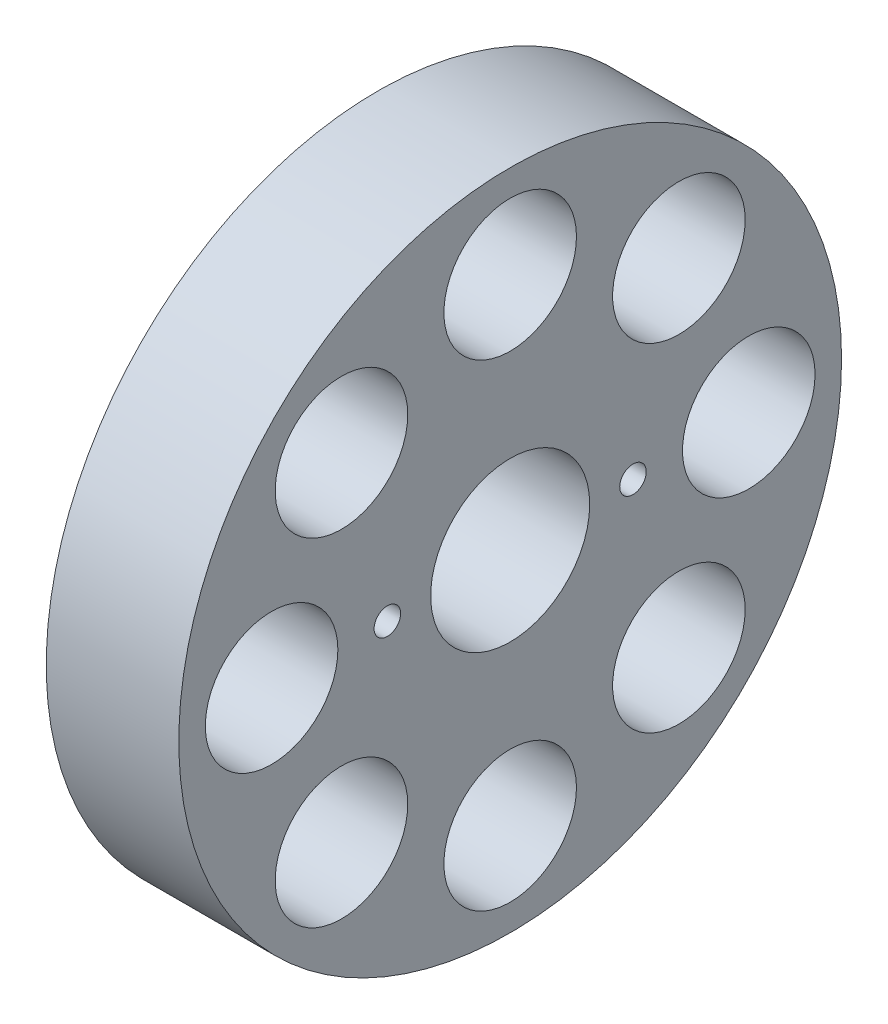
ISO-10303-21;
HEADER;
FILE_DESCRIPTION(('STEP AP214'),'2;1');
FILE_NAME('part.step','',(''),(''),'','','');
FILE_SCHEMA(('AUTOMOTIVE_DESIGN { 1 0 10303 214 1 1 1 1 }'));
ENDSEC;
DATA;
#1=APPLICATION_CONTEXT('core data for automotive mechanical design processes');
#2=APPLICATION_PROTOCOL_DEFINITION('international standard','automotive_design',2000,#1);
#3=PRODUCT_CONTEXT('',#1,'mechanical');
#4=PRODUCT('Part','Part','',(#3));
#5=PRODUCT_RELATED_PRODUCT_CATEGORY('part','',(#4));
#6=PRODUCT_DEFINITION_FORMATION('','',#4);
#7=PRODUCT_DEFINITION_CONTEXT('part definition',#1,'design');
#8=PRODUCT_DEFINITION('design','',#6,#7);
#9=PRODUCT_DEFINITION_SHAPE('','',#8);
#10=(LENGTH_UNIT() NAMED_UNIT(*) SI_UNIT(.MILLI.,.METRE.));
#11=(NAMED_UNIT(*) PLANE_ANGLE_UNIT() SI_UNIT($,.RADIAN.));
#12=(NAMED_UNIT(*) SI_UNIT($,.STERADIAN.) SOLID_ANGLE_UNIT());
#13=UNCERTAINTY_MEASURE_WITH_UNIT(LENGTH_MEASURE(1.E-05),#10,'distance_accuracy_value','');
#14=(GEOMETRIC_REPRESENTATION_CONTEXT(3) GLOBAL_UNCERTAINTY_ASSIGNED_CONTEXT((#13)) GLOBAL_UNIT_ASSIGNED_CONTEXT((#10,
#11,#12)) REPRESENTATION_CONTEXT('',''));
#15=CARTESIAN_POINT('',(0.,0.,0.));
#16=DIRECTION('',(0.,0.,1.));
#17=DIRECTION('',(1.,0.,0.));
#18=AXIS2_PLACEMENT_3D('',#15,#16,#17);
#19=CARTESIAN_POINT('',(10.,0.,0.));
#20=DIRECTION('',(1.,0.,0.));
#21=DIRECTION('',(0.,0.,-1.));
#22=AXIS2_PLACEMENT_3D('',#19,#20,#21);
#23=PLANE('',#22);
#24=CARTESIAN_POINT('',(10.,0.,9.265));
#25=DIRECTION('',(1.,0.,0.));
#26=DIRECTION('',(0.,0.,-1.));
#27=AXIS2_PLACEMENT_3D('',#24,#25,#26);
#28=CIRCLE('',#27,1.);
#29=CARTESIAN_POINT('',(10.,0.,10.265));
#30=VERTEX_POINT('',#29);
#31=EDGE_CURVE('E103',#30,#30,#28,.T.);
#32=ORIENTED_EDGE('',*,*,#31,.F.);
#33=EDGE_LOOP('',(#32));
#34=FACE_BOUND('',#33,.T.);
#35=CARTESIAN_POINT('',(10.,0.,-9.265));
#36=DIRECTION('',(1.,0.,0.));
#37=DIRECTION('',(0.,0.,-1.));
#38=AXIS2_PLACEMENT_3D('',#35,#36,#37);
#39=CIRCLE('',#38,1.);
#40=CARTESIAN_POINT('',(10.,0.,-8.265));
#41=VERTEX_POINT('',#40);
#42=EDGE_CURVE('E95',#41,#41,#39,.T.);
#43=ORIENTED_EDGE('',*,*,#42,.F.);
#44=EDGE_LOOP('',(#43));
#45=FACE_BOUND('',#44,.T.);
#46=CARTESIAN_POINT('',(10.,0.,18.));
#47=DIRECTION('',(1.,0.,0.));
#48=DIRECTION('',(0.,0.,-1.));
#49=AXIS2_PLACEMENT_3D('',#46,#47,#48);
#50=CIRCLE('',#49,5.);
#51=CARTESIAN_POINT('',(10.,0.,13.));
#52=VERTEX_POINT('',#51);
#53=EDGE_CURVE('E83',#52,#52,#50,.T.);
#54=ORIENTED_EDGE('',*,*,#53,.F.);
#55=EDGE_LOOP('',(#54));
#56=FACE_BOUND('',#55,.T.);
#57=CARTESIAN_POINT('',(10.,-18.,0.));
#58=DIRECTION('',(1.,0.,0.));
#59=DIRECTION('',(0.,0.,-1.));
#60=AXIS2_PLACEMENT_3D('',#57,#58,#59);
#61=CIRCLE('',#60,5.);
#62=CARTESIAN_POINT('',(10.,-18.,-5.00000000000001));
#63=VERTEX_POINT('',#62);
#64=EDGE_CURVE('E71',#63,#63,#61,.T.);
#65=ORIENTED_EDGE('',*,*,#64,.F.);
#66=EDGE_LOOP('',(#65));
#67=FACE_BOUND('',#66,.T.);
#68=CARTESIAN_POINT('',(10.,0.,-18.));
#69=DIRECTION('',(1.,0.,0.));
#70=DIRECTION('',(0.,0.,-1.));
#71=AXIS2_PLACEMENT_3D('',#68,#69,#70);
#72=CIRCLE('',#71,5.);
#73=CARTESIAN_POINT('',(10.,0.,-23.));
#74=VERTEX_POINT('',#73);
#75=EDGE_CURVE('E59',#74,#74,#72,.T.);
#76=ORIENTED_EDGE('',*,*,#75,.F.);
#77=EDGE_LOOP('',(#76));
#78=FACE_BOUND('',#77,.T.);
#79=CARTESIAN_POINT('',(10.,0.,0.));
#80=DIRECTION('',(1.,0.,0.));
#81=DIRECTION('',(0.,0.,-1.));
#82=AXIS2_PLACEMENT_3D('',#79,#80,#81);
#83=CIRCLE('',#82,6.);
#84=CARTESIAN_POINT('',(10.,0.,-6.));
#85=VERTEX_POINT('',#84);
#86=EDGE_CURVE('E47',#85,#85,#83,.T.);
#87=ORIENTED_EDGE('',*,*,#86,.F.);
#88=EDGE_LOOP('',(#87));
#89=FACE_BOUND('',#88,.T.);
#90=CARTESIAN_POINT('',(10.,0.,0.));
#91=DIRECTION('',(1.,0.,0.));
#92=DIRECTION('',(0.,0.,-1.));
#93=AXIS2_PLACEMENT_3D('',#90,#91,#92);
#94=CIRCLE('',#93,25.);
#95=CARTESIAN_POINT('',(10.,0.,-25.));
#96=VERTEX_POINT('',#95);
#97=EDGE_CURVE('E10',#96,#96,#94,.T.);
#98=ORIENTED_EDGE('',*,*,#97,.T.);
#99=EDGE_LOOP('',(#98));
#100=FACE_BOUND('',#99,.T.);
#101=CARTESIAN_POINT('',(10.,18.,0.));
#102=DIRECTION('',(1.,0.,0.));
#103=DIRECTION('',(0.,0.,-1.));
#104=AXIS2_PLACEMENT_3D('',#101,#102,#103);
#105=CIRCLE('',#104,5.);
#106=CARTESIAN_POINT('',(10.,18.,-5.));
#107=VERTEX_POINT('',#106);
#108=EDGE_CURVE('E42',#107,#107,#105,.T.);
#109=ORIENTED_EDGE('',*,*,#108,.F.);
#110=EDGE_LOOP('',(#109));
#111=FACE_BOUND('',#110,.T.);
#112=CARTESIAN_POINT('',(10.,12.7279220613579,-12.7279220613579));
#113=DIRECTION('',(1.,0.,0.));
#114=DIRECTION('',(0.,0.,-1.));
#115=AXIS2_PLACEMENT_3D('',#112,#113,#114);
#116=CIRCLE('',#115,5.);
#117=CARTESIAN_POINT('',(10.,12.7279220613579,-17.7279220613579));
#118=VERTEX_POINT('',#117);
#119=EDGE_CURVE('E53',#118,#118,#116,.T.);
#120=ORIENTED_EDGE('',*,*,#119,.F.);
#121=EDGE_LOOP('',(#120));
#122=FACE_BOUND('',#121,.T.);
#123=CARTESIAN_POINT('',(10.,-12.7279220613579,-12.7279220613579));
#124=DIRECTION('',(1.,0.,0.));
#125=DIRECTION('',(0.,0.,-1.));
#126=AXIS2_PLACEMENT_3D('',#123,#124,#125);
#127=CIRCLE('',#126,5.);
#128=CARTESIAN_POINT('',(10.,-12.7279220613579,-17.7279220613579));
#129=VERTEX_POINT('',#128);
#130=EDGE_CURVE('E65',#129,#129,#127,.T.);
#131=ORIENTED_EDGE('',*,*,#130,.F.);
#132=EDGE_LOOP('',(#131));
#133=FACE_BOUND('',#132,.T.);
#134=CARTESIAN_POINT('',(10.,-12.7279220613579,12.7279220613579));
#135=DIRECTION('',(1.,0.,0.));
#136=DIRECTION('',(0.,0.,-1.));
#137=AXIS2_PLACEMENT_3D('',#134,#135,#136);
#138=CIRCLE('',#137,5.);
#139=CARTESIAN_POINT('',(10.,-12.7279220613579,7.72792206135785));
#140=VERTEX_POINT('',#139);
#141=EDGE_CURVE('E77',#140,#140,#138,.T.);
#142=ORIENTED_EDGE('',*,*,#141,.F.);
#143=EDGE_LOOP('',(#142));
#144=FACE_BOUND('',#143,.T.);
#145=CARTESIAN_POINT('',(10.,12.7279220613579,12.7279220613579));
#146=DIRECTION('',(1.,0.,0.));
#147=DIRECTION('',(0.,0.,-1.));
#148=AXIS2_PLACEMENT_3D('',#145,#146,#147);
#149=CIRCLE('',#148,5.);
#150=CARTESIAN_POINT('',(10.,12.7279220613579,7.72792206135786));
#151=VERTEX_POINT('',#150);
#152=EDGE_CURVE('E89',#151,#151,#149,.T.);
#153=ORIENTED_EDGE('',*,*,#152,.F.);
#154=EDGE_LOOP('',(#153));
#155=FACE_BOUND('',#154,.T.);
#156=ADVANCED_FACE('F31',(#34,#45,#56,#67,#78,#89,#100,#111,#122,#133,#144,#155),#23,.T.);
#157=CARTESIAN_POINT('',(0.,0.,0.));
#158=DIRECTION('',(1.,0.,0.));
#159=DIRECTION('',(0.,0.,-1.));
#160=AXIS2_PLACEMENT_3D('',#157,#158,#159);
#161=PLANE('',#160);
#162=CARTESIAN_POINT('',(0.,0.,9.265));
#163=DIRECTION('',(-1.,0.,0.));
#164=DIRECTION('',(0.,0.,-1.));
#165=AXIS2_PLACEMENT_3D('',#162,#163,#164);
#166=CIRCLE('',#165,1.);
#167=CARTESIAN_POINT('',(0.,0.,10.265));
#168=VERTEX_POINT('',#167);
#169=EDGE_CURVE('E106',#168,#168,#166,.T.);
#170=ORIENTED_EDGE('',*,*,#169,.F.);
#171=EDGE_LOOP('',(#170));
#172=FACE_BOUND('',#171,.T.);
#173=CARTESIAN_POINT('',(0.,0.,-9.265));
#174=DIRECTION('',(-1.,0.,0.));
#175=DIRECTION('',(0.,0.,1.));
#176=AXIS2_PLACEMENT_3D('',#173,#174,#175);
#177=CIRCLE('',#176,1.);
#178=CARTESIAN_POINT('',(0.,0.,-8.265));
#179=VERTEX_POINT('',#178);
#180=EDGE_CURVE('E100',#179,#179,#177,.T.);
#181=ORIENTED_EDGE('',*,*,#180,.F.);
#182=EDGE_LOOP('',(#181));
#183=FACE_BOUND('',#182,.T.);
#184=CARTESIAN_POINT('',(0.,0.,0.));
#185=DIRECTION('',(1.,0.,0.));
#186=DIRECTION('',(0.,0.,-1.));
#187=AXIS2_PLACEMENT_3D('',#184,#185,#186);
#188=CIRCLE('',#187,25.);
#189=CARTESIAN_POINT('',(0.,0.,-25.));
#190=VERTEX_POINT('',#189);
#191=EDGE_CURVE('E35',#190,#190,#188,.T.);
#192=ORIENTED_EDGE('',*,*,#191,.F.);
#193=EDGE_LOOP('',(#192));
#194=FACE_BOUND('',#193,.T.);
#195=CARTESIAN_POINT('',(0.,18.,0.));
#196=DIRECTION('',(1.,0.,0.));
#197=DIRECTION('',(0.,0.,-1.));
#198=AXIS2_PLACEMENT_3D('',#195,#196,#197);
#199=CIRCLE('',#198,5.);
#200=CARTESIAN_POINT('',(0.,18.,-5.));
#201=VERTEX_POINT('',#200);
#202=EDGE_CURVE('E44',#201,#201,#199,.T.);
#203=ORIENTED_EDGE('',*,*,#202,.T.);
#204=EDGE_LOOP('',(#203));
#205=FACE_BOUND('',#204,.T.);
#206=CARTESIAN_POINT('',(0.,0.,0.));
#207=DIRECTION('',(1.,0.,0.));
#208=DIRECTION('',(0.,0.,-1.));
#209=AXIS2_PLACEMENT_3D('',#206,#207,#208);
#210=CIRCLE('',#209,6.);
#211=CARTESIAN_POINT('',(0.,0.,-6.));
#212=VERTEX_POINT('',#211);
#213=EDGE_CURVE('E50',#212,#212,#210,.T.);
#214=ORIENTED_EDGE('',*,*,#213,.T.);
#215=EDGE_LOOP('',(#214));
#216=FACE_BOUND('',#215,.T.);
#217=CARTESIAN_POINT('',(0.,12.7279220613579,-12.7279220613579));
#218=DIRECTION('',(1.,0.,0.));
#219=DIRECTION('',(0.,0.,-1.));
#220=AXIS2_PLACEMENT_3D('',#217,#218,#219);
#221=CIRCLE('',#220,5.);
#222=CARTESIAN_POINT('',(0.,12.7279220613579,-17.7279220613579));
#223=VERTEX_POINT('',#222);
#224=EDGE_CURVE('E56',#223,#223,#221,.T.);
#225=ORIENTED_EDGE('',*,*,#224,.T.);
#226=EDGE_LOOP('',(#225));
#227=FACE_BOUND('',#226,.T.);
#228=CARTESIAN_POINT('',(0.,0.,-18.));
#229=DIRECTION('',(1.,0.,0.));
#230=DIRECTION('',(0.,0.,-1.));
#231=AXIS2_PLACEMENT_3D('',#228,#229,#230);
#232=CIRCLE('',#231,5.);
#233=CARTESIAN_POINT('',(0.,0.,-23.));
#234=VERTEX_POINT('',#233);
#235=EDGE_CURVE('E62',#234,#234,#232,.T.);
#236=ORIENTED_EDGE('',*,*,#235,.T.);
#237=EDGE_LOOP('',(#236));
#238=FACE_BOUND('',#237,.T.);
#239=CARTESIAN_POINT('',(0.,-12.7279220613579,-12.7279220613579));
#240=DIRECTION('',(1.,0.,0.));
#241=DIRECTION('',(0.,0.,-1.));
#242=AXIS2_PLACEMENT_3D('',#239,#240,#241);
#243=CIRCLE('',#242,5.);
#244=CARTESIAN_POINT('',(0.,-12.7279220613579,-17.7279220613579));
#245=VERTEX_POINT('',#244);
#246=EDGE_CURVE('E68',#245,#245,#243,.T.);
#247=ORIENTED_EDGE('',*,*,#246,.T.);
#248=EDGE_LOOP('',(#247));
#249=FACE_BOUND('',#248,.T.);
#250=CARTESIAN_POINT('',(0.,-18.,0.));
#251=DIRECTION('',(1.,0.,0.));
#252=DIRECTION('',(0.,0.,-1.));
#253=AXIS2_PLACEMENT_3D('',#250,#251,#252);
#254=CIRCLE('',#253,5.);
#255=CARTESIAN_POINT('',(0.,-18.,-5.00000000000001));
#256=VERTEX_POINT('',#255);
#257=EDGE_CURVE('E74',#256,#256,#254,.T.);
#258=ORIENTED_EDGE('',*,*,#257,.T.);
#259=EDGE_LOOP('',(#258));
#260=FACE_BOUND('',#259,.T.);
#261=CARTESIAN_POINT('',(0.,-12.7279220613579,12.7279220613579));
#262=DIRECTION('',(1.,0.,0.));
#263=DIRECTION('',(0.,0.,-1.));
#264=AXIS2_PLACEMENT_3D('',#261,#262,#263);
#265=CIRCLE('',#264,5.);
#266=CARTESIAN_POINT('',(0.,-12.7279220613579,7.72792206135785));
#267=VERTEX_POINT('',#266);
#268=EDGE_CURVE('E80',#267,#267,#265,.T.);
#269=ORIENTED_EDGE('',*,*,#268,.T.);
#270=EDGE_LOOP('',(#269));
#271=FACE_BOUND('',#270,.T.);
#272=CARTESIAN_POINT('',(0.,0.,18.));
#273=DIRECTION('',(1.,0.,0.));
#274=DIRECTION('',(0.,0.,-1.));
#275=AXIS2_PLACEMENT_3D('',#272,#273,#274);
#276=CIRCLE('',#275,5.);
#277=CARTESIAN_POINT('',(0.,0.,13.));
#278=VERTEX_POINT('',#277);
#279=EDGE_CURVE('E86',#278,#278,#276,.T.);
#280=ORIENTED_EDGE('',*,*,#279,.T.);
#281=EDGE_LOOP('',(#280));
#282=FACE_BOUND('',#281,.T.);
#283=CARTESIAN_POINT('',(0.,12.7279220613579,12.7279220613579));
#284=DIRECTION('',(1.,0.,0.));
#285=DIRECTION('',(0.,0.,-1.));
#286=AXIS2_PLACEMENT_3D('',#283,#284,#285);
#287=CIRCLE('',#286,5.);
#288=CARTESIAN_POINT('',(0.,12.7279220613579,7.72792206135786));
#289=VERTEX_POINT('',#288);
#290=EDGE_CURVE('E92',#289,#289,#287,.T.);
#291=ORIENTED_EDGE('',*,*,#290,.T.);
#292=EDGE_LOOP('',(#291));
#293=FACE_BOUND('',#292,.T.);
#294=ADVANCED_FACE('F112',(#172,#183,#194,#205,#216,#227,#238,#249,#260,#271,#282,#293),#161,.F.);
#295=CARTESIAN_POINT('',(10.,0.,0.));
#296=DIRECTION('',(-1.,0.,0.));
#297=DIRECTION('',(0.,0.,1.));
#298=AXIS2_PLACEMENT_3D('',#295,#296,#297);
#299=CYLINDRICAL_SURFACE('',#298,25.);
#300=ORIENTED_EDGE('',*,*,#97,.F.);
#301=EDGE_LOOP('',(#300));
#302=FACE_BOUND('',#301,.T.);
#303=ORIENTED_EDGE('',*,*,#191,.T.);
#304=EDGE_LOOP('',(#303));
#305=FACE_BOUND('',#304,.T.);
#306=ADVANCED_FACE('F33',(#302,#305),#299,.T.);
#307=CARTESIAN_POINT('',(10.,18.,0.));
#308=DIRECTION('',(-1.,0.,0.));
#309=DIRECTION('',(0.,0.,1.));
#310=AXIS2_PLACEMENT_3D('',#307,#308,#309);
#311=CYLINDRICAL_SURFACE('',#310,5.);
#312=ORIENTED_EDGE('',*,*,#108,.T.);
#313=EDGE_LOOP('',(#312));
#314=FACE_BOUND('',#313,.T.);
#315=ORIENTED_EDGE('',*,*,#202,.F.);
#316=EDGE_LOOP('',(#315));
#317=FACE_BOUND('',#316,.T.);
#318=ADVANCED_FACE('F160',(#314,#317),#311,.F.);
#319=CARTESIAN_POINT('',(10.,0.,0.));
#320=DIRECTION('',(-1.,0.,0.));
#321=DIRECTION('',(0.,0.,1.));
#322=AXIS2_PLACEMENT_3D('',#319,#320,#321);
#323=CYLINDRICAL_SURFACE('',#322,6.);
#324=ORIENTED_EDGE('',*,*,#86,.T.);
#325=EDGE_LOOP('',(#324));
#326=FACE_BOUND('',#325,.T.);
#327=ORIENTED_EDGE('',*,*,#213,.F.);
#328=EDGE_LOOP('',(#327));
#329=FACE_BOUND('',#328,.T.);
#330=ADVANCED_FACE('F163',(#326,#329),#323,.F.);
#331=CARTESIAN_POINT('',(10.,12.7279220613579,-12.7279220613579));
#332=DIRECTION('',(-1.,0.,0.));
#333=DIRECTION('',(0.,0.,1.));
#334=AXIS2_PLACEMENT_3D('',#331,#332,#333);
#335=CYLINDRICAL_SURFACE('',#334,5.);
#336=ORIENTED_EDGE('',*,*,#119,.T.);
#337=EDGE_LOOP('',(#336));
#338=FACE_BOUND('',#337,.T.);
#339=ORIENTED_EDGE('',*,*,#224,.F.);
#340=EDGE_LOOP('',(#339));
#341=FACE_BOUND('',#340,.T.);
#342=ADVANCED_FACE('F167',(#338,#341),#335,.F.);
#343=CARTESIAN_POINT('',(10.,0.,-18.));
#344=DIRECTION('',(-1.,0.,0.));
#345=DIRECTION('',(0.,0.,1.));
#346=AXIS2_PLACEMENT_3D('',#343,#344,#345);
#347=CYLINDRICAL_SURFACE('',#346,5.);
#348=ORIENTED_EDGE('',*,*,#75,.T.);
#349=EDGE_LOOP('',(#348));
#350=FACE_BOUND('',#349,.T.);
#351=ORIENTED_EDGE('',*,*,#235,.F.);
#352=EDGE_LOOP('',(#351));
#353=FACE_BOUND('',#352,.T.);
#354=ADVANCED_FACE('F171',(#350,#353),#347,.F.);
#355=CARTESIAN_POINT('',(10.,-12.7279220613579,-12.7279220613579));
#356=DIRECTION('',(-1.,0.,0.));
#357=DIRECTION('',(0.,0.,1.));
#358=AXIS2_PLACEMENT_3D('',#355,#356,#357);
#359=CYLINDRICAL_SURFACE('',#358,5.);
#360=ORIENTED_EDGE('',*,*,#130,.T.);
#361=EDGE_LOOP('',(#360));
#362=FACE_BOUND('',#361,.T.);
#363=ORIENTED_EDGE('',*,*,#246,.F.);
#364=EDGE_LOOP('',(#363));
#365=FACE_BOUND('',#364,.T.);
#366=ADVANCED_FACE('F175',(#362,#365),#359,.F.);
#367=CARTESIAN_POINT('',(10.,-18.,0.));
#368=DIRECTION('',(-1.,0.,0.));
#369=DIRECTION('',(0.,0.,1.));
#370=AXIS2_PLACEMENT_3D('',#367,#368,#369);
#371=CYLINDRICAL_SURFACE('',#370,5.);
#372=ORIENTED_EDGE('',*,*,#64,.T.);
#373=EDGE_LOOP('',(#372));
#374=FACE_BOUND('',#373,.T.);
#375=ORIENTED_EDGE('',*,*,#257,.F.);
#376=EDGE_LOOP('',(#375));
#377=FACE_BOUND('',#376,.T.);
#378=ADVANCED_FACE('F179',(#374,#377),#371,.F.);
#379=CARTESIAN_POINT('',(10.,-12.7279220613579,12.7279220613579));
#380=DIRECTION('',(-1.,0.,0.));
#381=DIRECTION('',(0.,0.,1.));
#382=AXIS2_PLACEMENT_3D('',#379,#380,#381);
#383=CYLINDRICAL_SURFACE('',#382,5.);
#384=ORIENTED_EDGE('',*,*,#141,.T.);
#385=EDGE_LOOP('',(#384));
#386=FACE_BOUND('',#385,.T.);
#387=ORIENTED_EDGE('',*,*,#268,.F.);
#388=EDGE_LOOP('',(#387));
#389=FACE_BOUND('',#388,.T.);
#390=ADVANCED_FACE('F149',(#386,#389),#383,.F.);
#391=CARTESIAN_POINT('',(10.,0.,18.));
#392=DIRECTION('',(-1.,0.,0.));
#393=DIRECTION('',(0.,0.,1.));
#394=AXIS2_PLACEMENT_3D('',#391,#392,#393);
#395=CYLINDRICAL_SURFACE('',#394,5.);
#396=ORIENTED_EDGE('',*,*,#53,.T.);
#397=EDGE_LOOP('',(#396));
#398=FACE_BOUND('',#397,.T.);
#399=ORIENTED_EDGE('',*,*,#279,.F.);
#400=EDGE_LOOP('',(#399));
#401=FACE_BOUND('',#400,.T.);
#402=ADVANCED_FACE('F140',(#398,#401),#395,.F.);
#403=CARTESIAN_POINT('',(10.,12.7279220613579,12.7279220613579));
#404=DIRECTION('',(-1.,0.,0.));
#405=DIRECTION('',(0.,0.,1.));
#406=AXIS2_PLACEMENT_3D('',#403,#404,#405);
#407=CYLINDRICAL_SURFACE('',#406,5.);
#408=ORIENTED_EDGE('',*,*,#152,.T.);
#409=EDGE_LOOP('',(#408));
#410=FACE_BOUND('',#409,.T.);
#411=ORIENTED_EDGE('',*,*,#290,.F.);
#412=EDGE_LOOP('',(#411));
#413=FACE_BOUND('',#412,.T.);
#414=ADVANCED_FACE('F137',(#410,#413),#407,.F.);
#415=CARTESIAN_POINT('',(15.,0.,-9.265));
#416=DIRECTION('',(-1.,0.,0.));
#417=DIRECTION('',(0.,0.,1.));
#418=AXIS2_PLACEMENT_3D('',#415,#416,#417);
#419=CYLINDRICAL_SURFACE('',#418,1.);
#420=CARTESIAN_POINT('',(10.,0.,-8.265));
#421=CARTESIAN_POINT('',(9.89583333333333,0.,-8.265));
#422=CARTESIAN_POINT('',(9.79166666666667,0.,-8.265));
#423=CARTESIAN_POINT('',(9.58333333333333,0.,-8.265));
#424=CARTESIAN_POINT('',(9.47916666666667,0.,-8.265));
#425=CARTESIAN_POINT('',(9.27083333333333,0.,-8.265));
#426=CARTESIAN_POINT('',(9.16666666666667,0.,-8.265));
#427=CARTESIAN_POINT('',(8.95833333333333,0.,-8.265));
#428=CARTESIAN_POINT('',(8.85416666666667,0.,-8.265));
#429=CARTESIAN_POINT('',(8.64583333333333,0.,-8.265));
#430=CARTESIAN_POINT('',(8.54166666666667,0.,-8.265));
#431=CARTESIAN_POINT('',(8.33333333333333,0.,-8.265));
#432=CARTESIAN_POINT('',(8.22916666666667,0.,-8.265));
#433=CARTESIAN_POINT('',(8.02083333333333,0.,-8.265));
#434=CARTESIAN_POINT('',(7.91666666666667,0.,-8.265));
#435=CARTESIAN_POINT('',(7.70833333333333,0.,-8.265));
#436=CARTESIAN_POINT('',(7.60416666666667,0.,-8.265));
#437=CARTESIAN_POINT('',(7.39583333333333,0.,-8.265));
#438=CARTESIAN_POINT('',(7.29166666666667,0.,-8.265));
#439=CARTESIAN_POINT('',(7.08333333333333,0.,-8.265));
#440=CARTESIAN_POINT('',(6.97916666666667,0.,-8.265));
#441=CARTESIAN_POINT('',(6.77083333333333,0.,-8.265));
#442=CARTESIAN_POINT('',(6.66666666666667,0.,-8.265));
#443=CARTESIAN_POINT('',(6.45833333333333,0.,-8.265));
#444=CARTESIAN_POINT('',(6.35416666666667,0.,-8.265));
#445=CARTESIAN_POINT('',(6.14583333333333,0.,-8.265));
#446=CARTESIAN_POINT('',(6.04166666666667,0.,-8.265));
#447=CARTESIAN_POINT('',(5.83333333333333,0.,-8.265));
#448=CARTESIAN_POINT('',(5.72916666666667,0.,-8.265));
#449=CARTESIAN_POINT('',(5.52083333333333,0.,-8.265));
#450=CARTESIAN_POINT('',(5.41666666666667,0.,-8.265));
#451=CARTESIAN_POINT('',(5.20833333333333,0.,-8.265));
#452=CARTESIAN_POINT('',(5.10416666666667,0.,-8.265));
#453=CARTESIAN_POINT('',(4.89583333333333,0.,-8.265));
#454=CARTESIAN_POINT('',(4.79166666666667,0.,-8.265));
#455=CARTESIAN_POINT('',(4.58333333333333,0.,-8.265));
#456=CARTESIAN_POINT('',(4.47916666666667,0.,-8.265));
#457=CARTESIAN_POINT('',(4.27083333333333,0.,-8.265));
#458=CARTESIAN_POINT('',(4.16666666666667,0.,-8.265));
#459=CARTESIAN_POINT('',(3.95833333333333,0.,-8.265));
#460=CARTESIAN_POINT('',(3.85416666666667,0.,-8.265));
#461=CARTESIAN_POINT('',(3.64583333333333,0.,-8.265));
#462=CARTESIAN_POINT('',(3.54166666666667,0.,-8.265));
#463=CARTESIAN_POINT('',(3.33333333333333,0.,-8.265));
#464=CARTESIAN_POINT('',(3.22916666666667,0.,-8.265));
#465=CARTESIAN_POINT('',(3.02083333333333,0.,-8.265));
#466=CARTESIAN_POINT('',(2.91666666666667,0.,-8.265));
#467=CARTESIAN_POINT('',(2.70833333333333,0.,-8.265));
#468=CARTESIAN_POINT('',(2.60416666666667,0.,-8.265));
#469=CARTESIAN_POINT('',(2.39583333333333,0.,-8.265));
#470=CARTESIAN_POINT('',(2.29166666666667,0.,-8.265));
#471=CARTESIAN_POINT('',(2.08333333333333,0.,-8.265));
#472=CARTESIAN_POINT('',(1.97916666666667,0.,-8.265));
#473=CARTESIAN_POINT('',(1.77083333333333,0.,-8.265));
#474=CARTESIAN_POINT('',(1.66666666666667,0.,-8.265));
#475=CARTESIAN_POINT('',(1.45833333333333,0.,-8.265));
#476=CARTESIAN_POINT('',(1.35416666666667,0.,-8.265));
#477=CARTESIAN_POINT('',(1.14583333333333,0.,-8.265));
#478=CARTESIAN_POINT('',(1.04166666666667,0.,-8.265));
#479=CARTESIAN_POINT('',(0.833333333333334,0.,-8.265));
#480=CARTESIAN_POINT('',(0.729166666666667,0.,-8.265));
#481=CARTESIAN_POINT('',(0.520833333333334,0.,-8.265));
#482=CARTESIAN_POINT('',(0.416666666666667,0.,-8.265));
#483=CARTESIAN_POINT('',(0.208333333333334,0.,-8.265));
#484=CARTESIAN_POINT('',(0.104166666666667,0.,-8.265));
#485=CARTESIAN_POINT('',(0.,0.,-8.265));
#486=B_SPLINE_CURVE_WITH_KNOTS('',3,(#420,#421,#422,#423,#424,#425,#426,#427,#428,#429,#430,
#431,#432,#433,#434,#435,#436,#437,#438,#439,#440,#441,#442,#443,#444,#445,#446,#447,#448,#449,
#450,#451,#452,#453,#454,#455,#456,#457,#458,#459,#460,#461,#462,#463,#464,#465,#466,#467,#468,
#469,#470,#471,#472,#473,#474,#475,#476,#477,#478,#479,#480,#481,#482,#483,#484,#485),
.UNSPECIFIED.,.F.,.F.,(4,2,2,2,2,2,2,2,2,2,2,2,2,2,2,2,2,2,2,2,2,2,2,2,2,2,2,2,2,2,2,2,4),(0.,
0.3125,0.624999999999999,0.937499999999999,1.25,1.5625,1.875,2.1875,2.5,2.8125,3.125,3.4375,
3.75,4.0625,4.375,4.6875,5.,5.3125,5.625,5.9375,6.25,6.5625,6.875,7.1875,7.5,7.8125,8.125,
8.4375,8.75,9.0625,9.375,9.6875,10.),.UNSPECIFIED.);
#487=EDGE_CURVE('BSEAM139',#41,#179,#486,.T.);
#488=ORIENTED_EDGE('',*,*,#42,.T.);
#489=ORIENTED_EDGE('',*,*,#180,.T.);
#490=ORIENTED_EDGE('',*,*,#487,.T.);
#491=ORIENTED_EDGE('',*,*,#487,.F.);
#492=EDGE_LOOP('',(#488,#490,#489,#491));
#493=FACE_BOUND('',#492,.T.);
#494=ADVANCED_FACE('F139',(#493),#419,.F.);
#495=CARTESIAN_POINT('',(15.,0.,9.265));
#496=DIRECTION('',(-1.,0.,0.));
#497=DIRECTION('',(0.,0.,1.));
#498=AXIS2_PLACEMENT_3D('',#495,#496,#497);
#499=CYLINDRICAL_SURFACE('',#498,1.);
#500=CARTESIAN_POINT('',(10.,0.,10.265));
#501=CARTESIAN_POINT('',(9.89583333333333,0.,10.265));
#502=CARTESIAN_POINT('',(9.79166666666667,0.,10.265));
#503=CARTESIAN_POINT('',(9.58333333333333,0.,10.265));
#504=CARTESIAN_POINT('',(9.47916666666667,0.,10.265));
#505=CARTESIAN_POINT('',(9.27083333333333,0.,10.265));
#506=CARTESIAN_POINT('',(9.16666666666667,0.,10.265));
#507=CARTESIAN_POINT('',(8.95833333333333,0.,10.265));
#508=CARTESIAN_POINT('',(8.85416666666667,0.,10.265));
#509=CARTESIAN_POINT('',(8.64583333333333,0.,10.265));
#510=CARTESIAN_POINT('',(8.54166666666667,0.,10.265));
#511=CARTESIAN_POINT('',(8.33333333333333,0.,10.265));
#512=CARTESIAN_POINT('',(8.22916666666667,0.,10.265));
#513=CARTESIAN_POINT('',(8.02083333333333,0.,10.265));
#514=CARTESIAN_POINT('',(7.91666666666667,0.,10.265));
#515=CARTESIAN_POINT('',(7.70833333333333,0.,10.265));
#516=CARTESIAN_POINT('',(7.60416666666667,0.,10.265));
#517=CARTESIAN_POINT('',(7.39583333333333,0.,10.265));
#518=CARTESIAN_POINT('',(7.29166666666667,0.,10.265));
#519=CARTESIAN_POINT('',(7.08333333333333,0.,10.265));
#520=CARTESIAN_POINT('',(6.97916666666667,0.,10.265));
#521=CARTESIAN_POINT('',(6.77083333333333,0.,10.265));
#522=CARTESIAN_POINT('',(6.66666666666667,0.,10.265));
#523=CARTESIAN_POINT('',(6.45833333333333,0.,10.265));
#524=CARTESIAN_POINT('',(6.35416666666667,0.,10.265));
#525=CARTESIAN_POINT('',(6.14583333333333,0.,10.265));
#526=CARTESIAN_POINT('',(6.04166666666667,0.,10.265));
#527=CARTESIAN_POINT('',(5.83333333333333,0.,10.265));
#528=CARTESIAN_POINT('',(5.72916666666667,0.,10.265));
#529=CARTESIAN_POINT('',(5.52083333333333,0.,10.265));
#530=CARTESIAN_POINT('',(5.41666666666667,0.,10.265));
#531=CARTESIAN_POINT('',(5.20833333333333,0.,10.265));
#532=CARTESIAN_POINT('',(5.10416666666667,0.,10.265));
#533=CARTESIAN_POINT('',(4.89583333333333,0.,10.265));
#534=CARTESIAN_POINT('',(4.79166666666667,0.,10.265));
#535=CARTESIAN_POINT('',(4.58333333333333,0.,10.265));
#536=CARTESIAN_POINT('',(4.47916666666667,0.,10.265));
#537=CARTESIAN_POINT('',(4.27083333333333,0.,10.265));
#538=CARTESIAN_POINT('',(4.16666666666667,0.,10.265));
#539=CARTESIAN_POINT('',(3.95833333333333,0.,10.265));
#540=CARTESIAN_POINT('',(3.85416666666667,0.,10.265));
#541=CARTESIAN_POINT('',(3.64583333333333,0.,10.265));
#542=CARTESIAN_POINT('',(3.54166666666667,0.,10.265));
#543=CARTESIAN_POINT('',(3.33333333333333,0.,10.265));
#544=CARTESIAN_POINT('',(3.22916666666667,0.,10.265));
#545=CARTESIAN_POINT('',(3.02083333333333,0.,10.265));
#546=CARTESIAN_POINT('',(2.91666666666667,0.,10.265));
#547=CARTESIAN_POINT('',(2.70833333333333,0.,10.265));
#548=CARTESIAN_POINT('',(2.60416666666667,0.,10.265));
#549=CARTESIAN_POINT('',(2.39583333333333,0.,10.265));
#550=CARTESIAN_POINT('',(2.29166666666667,0.,10.265));
#551=CARTESIAN_POINT('',(2.08333333333333,0.,10.265));
#552=CARTESIAN_POINT('',(1.97916666666667,0.,10.265));
#553=CARTESIAN_POINT('',(1.77083333333333,0.,10.265));
#554=CARTESIAN_POINT('',(1.66666666666667,0.,10.265));
#555=CARTESIAN_POINT('',(1.45833333333333,0.,10.265));
#556=CARTESIAN_POINT('',(1.35416666666667,0.,10.265));
#557=CARTESIAN_POINT('',(1.14583333333333,0.,10.265));
#558=CARTESIAN_POINT('',(1.04166666666667,0.,10.265));
#559=CARTESIAN_POINT('',(0.833333333333334,0.,10.265));
#560=CARTESIAN_POINT('',(0.729166666666667,0.,10.265));
#561=CARTESIAN_POINT('',(0.520833333333334,0.,10.265));
#562=CARTESIAN_POINT('',(0.416666666666667,0.,10.265));
#563=CARTESIAN_POINT('',(0.208333333333334,0.,10.265));
#564=CARTESIAN_POINT('',(0.104166666666667,0.,10.265));
#565=CARTESIAN_POINT('',(0.,0.,10.265));
#566=B_SPLINE_CURVE_WITH_KNOTS('',3,(#500,#501,#502,#503,#504,#505,#506,#507,#508,#509,#510,
#511,#512,#513,#514,#515,#516,#517,#518,#519,#520,#521,#522,#523,#524,#525,#526,#527,#528,#529,
#530,#531,#532,#533,#534,#535,#536,#537,#538,#539,#540,#541,#542,#543,#544,#545,#546,#547,#548,
#549,#550,#551,#552,#553,#554,#555,#556,#557,#558,#559,#560,#561,#562,#563,#564,#565),
.UNSPECIFIED.,.F.,.F.,(4,2,2,2,2,2,2,2,2,2,2,2,2,2,2,2,2,2,2,2,2,2,2,2,2,2,2,2,2,2,2,2,4),(0.,
0.3125,0.624999999999999,0.937499999999999,1.25,1.5625,1.875,2.1875,2.5,2.8125,3.125,3.4375,
3.75,4.0625,4.375,4.6875,5.,5.3125,5.625,5.9375,6.25,6.5625,6.875,7.1875,7.5,7.8125,8.125,
8.4375,8.75,9.0625,9.375,9.6875,10.),.UNSPECIFIED.);
#567=EDGE_CURVE('BSEAM110',#30,#168,#566,.T.);
#568=ORIENTED_EDGE('',*,*,#31,.T.);
#569=ORIENTED_EDGE('',*,*,#169,.T.);
#570=ORIENTED_EDGE('',*,*,#567,.T.);
#571=ORIENTED_EDGE('',*,*,#567,.F.);
#572=EDGE_LOOP('',(#568,#570,#569,#571));
#573=FACE_BOUND('',#572,.T.);
#574=ADVANCED_FACE('F110',(#573),#499,.F.);
#575=CLOSED_SHELL('',(#156,#294,#306,#318,#330,#342,#354,#366,#378,#390,#402,#414,#494,#574));
#576=MANIFOLD_SOLID_BREP('B2',#575);
#577=ADVANCED_BREP_SHAPE_REPRESENTATION('',(#18,#576),#14);
#578=SHAPE_DEFINITION_REPRESENTATION(#9,#577);
ENDSEC;
END-ISO-10303-21;
